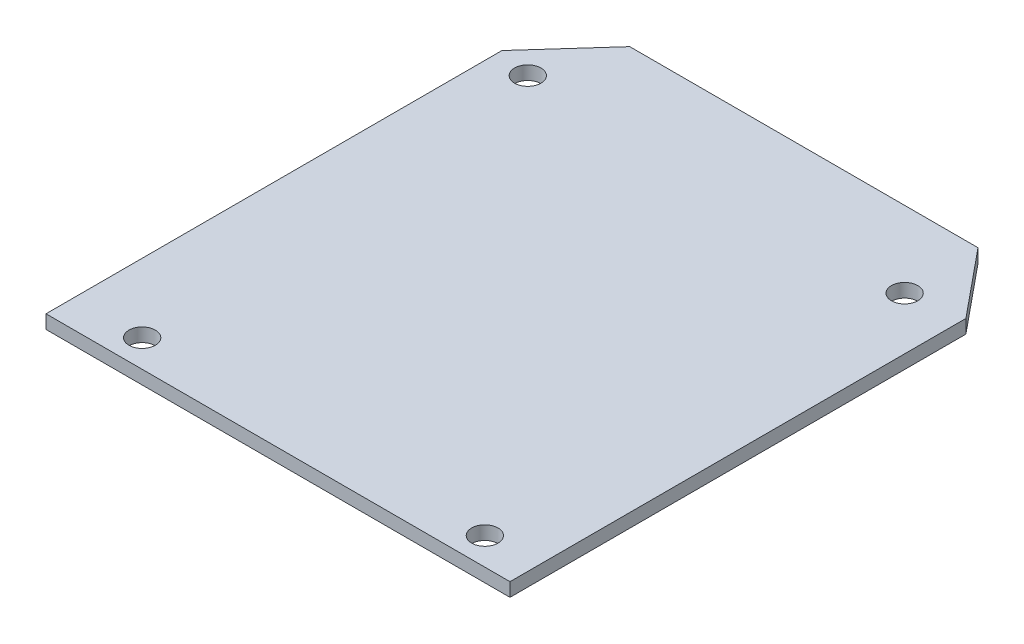
ISO-10303-21;
HEADER;
FILE_DESCRIPTION(('STEP AP214'),'2;1');
FILE_NAME('part.step','',(''),(''),'','','');
FILE_SCHEMA(('AUTOMOTIVE_DESIGN { 1 0 10303 214 1 1 1 1 }'));
ENDSEC;
DATA;
#1=APPLICATION_CONTEXT('core data for automotive mechanical design processes');
#2=APPLICATION_PROTOCOL_DEFINITION('international standard','automotive_design',2000,#1);
#3=PRODUCT_CONTEXT('',#1,'mechanical');
#4=PRODUCT('Part','Part','',(#3));
#5=PRODUCT_RELATED_PRODUCT_CATEGORY('part','',(#4));
#6=PRODUCT_DEFINITION_FORMATION('','',#4);
#7=PRODUCT_DEFINITION_CONTEXT('part definition',#1,'design');
#8=PRODUCT_DEFINITION('design','',#6,#7);
#9=PRODUCT_DEFINITION_SHAPE('','',#8);
#10=(LENGTH_UNIT() NAMED_UNIT(*) SI_UNIT(.MILLI.,.METRE.));
#11=(NAMED_UNIT(*) PLANE_ANGLE_UNIT() SI_UNIT($,.RADIAN.));
#12=(NAMED_UNIT(*) SI_UNIT($,.STERADIAN.) SOLID_ANGLE_UNIT());
#13=UNCERTAINTY_MEASURE_WITH_UNIT(LENGTH_MEASURE(1.E-05),#10,'distance_accuracy_value','');
#14=(GEOMETRIC_REPRESENTATION_CONTEXT(3) GLOBAL_UNCERTAINTY_ASSIGNED_CONTEXT((#13)) GLOBAL_UNIT_ASSIGNED_CONTEXT((#10,
#11,#12)) REPRESENTATION_CONTEXT('',''));
#15=CARTESIAN_POINT('',(0.,0.,0.));
#16=DIRECTION('',(0.,0.,1.));
#17=DIRECTION('',(1.,0.,0.));
#18=AXIS2_PLACEMENT_3D('',#15,#16,#17);
#19=CARTESIAN_POINT('',(-25.4,1.5875,31.75));
#20=DIRECTION('',(0.,0.,-1.));
#21=DIRECTION('',(-1.,0.,0.));
#22=AXIS2_PLACEMENT_3D('',#19,#20,#21);
#23=PLANE('',#22);
#24=DIRECTION('',(1.,0.,0.));
#25=VECTOR('',#24,1.);
#26=CARTESIAN_POINT('',(-25.4,1.5875,31.75));
#27=LINE('',#26,#25);
#28=CARTESIAN_POINT('',(-28.1388831989375,1.5875,31.75));
#29=VERTEX_POINT('',#28);
#30=CARTESIAN_POINT('',(28.1736861282768,1.5875,31.75));
#31=VERTEX_POINT('',#30);
#32=EDGE_CURVE('E50',#29,#31,#27,.T.);
#33=ORIENTED_EDGE('',*,*,#32,.F.);
#34=DIRECTION('',(0.,1.,0.));
#35=VECTOR('',#34,1.);
#36=CARTESIAN_POINT('',(-28.1388831989375,-0.0635,31.75));
#37=LINE('',#36,#35);
#38=CARTESIAN_POINT('',(-28.1388831989375,-0.0635,31.75));
#39=VERTEX_POINT('',#38);
#40=EDGE_CURVE('E119',#39,#29,#37,.T.);
#41=ORIENTED_EDGE('',*,*,#40,.F.);
#42=DIRECTION('',(1.,0.,0.));
#43=VECTOR('',#42,1.);
#44=CARTESIAN_POINT('',(-28.1388831989375,-0.0635,31.75));
#45=LINE('',#44,#43);
#46=CARTESIAN_POINT('',(28.1736861282768,-0.0635,31.75));
#47=VERTEX_POINT('',#46);
#48=EDGE_CURVE('E125',#39,#47,#45,.T.);
#49=ORIENTED_EDGE('',*,*,#48,.T.);
#50=DIRECTION('',(0.,1.,0.));
#51=VECTOR('',#50,1.);
#52=CARTESIAN_POINT('',(28.1736861282768,-0.0635,31.75));
#53=LINE('',#52,#51);
#54=EDGE_CURVE('E110',#47,#31,#53,.T.);
#55=ORIENTED_EDGE('',*,*,#54,.T.);
#56=EDGE_LOOP('',(#33,#41,#49,#55));
#57=FACE_BOUND('',#56,.T.);
#58=ADVANCED_FACE('F41',(#57),#23,.F.);
#59=CARTESIAN_POINT('',(-25.4,1.5875,-31.75));
#60=DIRECTION('',(0.,0.,1.));
#61=DIRECTION('',(1.,0.,0.));
#62=AXIS2_PLACEMENT_3D('',#59,#60,#61);
#63=PLANE('',#62);
#64=DIRECTION('',(-1.,0.,0.));
#65=VECTOR('',#64,1.);
#66=CARTESIAN_POINT('',(-25.4,1.5875,-31.75));
#67=LINE('',#66,#65);
#68=CARTESIAN_POINT('',(21.4730902903476,1.5875,-31.75));
#69=VERTEX_POINT('',#68);
#70=CARTESIAN_POINT('',(-20.7934211046502,1.5875,-31.75));
#71=VERTEX_POINT('',#70);
#72=EDGE_CURVE('E11',#69,#71,#67,.T.);
#73=ORIENTED_EDGE('',*,*,#72,.F.);
#74=DIRECTION('',(0.,1.,0.));
#75=VECTOR('',#74,1.);
#76=CARTESIAN_POINT('',(21.4730902903476,-0.0635,-31.75));
#77=LINE('',#76,#75);
#78=CARTESIAN_POINT('',(21.4730902903476,-0.0635,-31.75));
#79=VERTEX_POINT('',#78);
#80=EDGE_CURVE('E61',#79,#69,#77,.T.);
#81=ORIENTED_EDGE('',*,*,#80,.F.);
#82=DIRECTION('',(-1.,0.,0.));
#83=VECTOR('',#82,1.);
#84=CARTESIAN_POINT('',(-20.7934211046502,-0.0635,-31.75));
#85=LINE('',#84,#83);
#86=CARTESIAN_POINT('',(-20.7934211046502,-0.0635,-31.75));
#87=VERTEX_POINT('',#86);
#88=EDGE_CURVE('E155',#79,#87,#85,.T.);
#89=ORIENTED_EDGE('',*,*,#88,.T.);
#90=DIRECTION('',(0.,1.,0.));
#91=VECTOR('',#90,1.);
#92=CARTESIAN_POINT('',(-20.7934211046502,-0.0635,-31.75));
#93=LINE('',#92,#91);
#94=EDGE_CURVE('E99',#87,#71,#93,.T.);
#95=ORIENTED_EDGE('',*,*,#94,.T.);
#96=EDGE_LOOP('',(#73,#81,#89,#95));
#97=FACE_BOUND('',#96,.T.);
#98=ADVANCED_FACE('F197',(#97),#63,.F.);
#99=CARTESIAN_POINT('',(0.,1.5875,0.));
#100=DIRECTION('',(0.,1.,0.));
#101=DIRECTION('',(0.,0.,1.));
#102=AXIS2_PLACEMENT_3D('',#99,#100,#101);
#103=PLANE('',#102);
#104=CARTESIAN_POINT('',(21.8000857920604,1.5875,-22.5187904150701));
#105=DIRECTION('',(0.,1.,0.));
#106=DIRECTION('',(0.,0.,1.));
#107=AXIS2_PLACEMENT_3D('',#104,#105,#106);
#108=CIRCLE('',#107,1.6002);
#109=CARTESIAN_POINT('',(21.8000857920604,1.5875,-20.9185904150701));
#110=VERTEX_POINT('',#109);
#111=EDGE_CURVE('E187',#110,#110,#108,.T.);
#112=ORIENTED_EDGE('',*,*,#111,.F.);
#113=EDGE_LOOP('',(#112));
#114=FACE_BOUND('',#113,.T.);
#115=CARTESIAN_POINT('',(-23.9380994204934,1.5875,-22.5187904150701));
#116=DIRECTION('',(0.,1.,0.));
#117=DIRECTION('',(0.,0.,1.));
#118=AXIS2_PLACEMENT_3D('',#115,#116,#117);
#119=CIRCLE('',#118,1.6002);
#120=CARTESIAN_POINT('',(-23.9380994204934,1.5875,-20.9185904150701));
#121=VERTEX_POINT('',#120);
#122=EDGE_CURVE('E176',#121,#121,#119,.T.);
#123=ORIENTED_EDGE('',*,*,#122,.F.);
#124=EDGE_LOOP('',(#123));
#125=FACE_BOUND('',#124,.T.);
#126=CARTESIAN_POINT('',(-19.7900233457498,1.5875,28.4281023917217));
#127=DIRECTION('',(0.,1.,0.));
#128=DIRECTION('',(0.,0.,1.));
#129=AXIS2_PLACEMENT_3D('',#126,#127,#128);
#130=CIRCLE('',#129,1.6002);
#131=CARTESIAN_POINT('',(-19.7900233457498,1.5875,30.0283023917217));
#132=VERTEX_POINT('',#131);
#133=EDGE_CURVE('E172',#132,#132,#130,.T.);
#134=ORIENTED_EDGE('',*,*,#133,.F.);
#135=EDGE_LOOP('',(#134));
#136=FACE_BOUND('',#135,.T.);
#137=CARTESIAN_POINT('',(21.8000857920604,1.5875,28.4281023917217));
#138=DIRECTION('',(0.,1.,0.));
#139=DIRECTION('',(0.,0.,1.));
#140=AXIS2_PLACEMENT_3D('',#137,#138,#139);
#141=CIRCLE('',#140,1.6002);
#142=CARTESIAN_POINT('',(21.8000857920604,1.5875,30.0283023917217));
#143=VERTEX_POINT('',#142);
#144=EDGE_CURVE('E169',#143,#143,#141,.T.);
#145=ORIENTED_EDGE('',*,*,#144,.F.);
#146=EDGE_LOOP('',(#145));
#147=FACE_BOUND('',#146,.T.);
#148=DIRECTION('',(-0.634217019953723,0.,-0.773155076036509));
#149=VECTOR('',#148,1.);
#150=CARTESIAN_POINT('',(28.1736861282768,1.5875,-23.5815032211811));
#151=LINE('',#150,#149);
#152=CARTESIAN_POINT('',(28.1736861282768,1.5875,-23.5815032211811));
#153=VERTEX_POINT('',#152);
#154=EDGE_CURVE('E152',#153,#69,#151,.T.);
#155=ORIENTED_EDGE('',*,*,#154,.T.);
#156=ORIENTED_EDGE('',*,*,#72,.T.);
#157=DIRECTION('',(-0.668653613400306,0.,0.743574034838975));
#158=VECTOR('',#157,1.);
#159=CARTESIAN_POINT('',(-20.7934211046502,1.5875,-31.75));
#160=LINE('',#159,#158);
#161=CARTESIAN_POINT('',(-28.1388831989376,1.5875,-23.5815032211811));
#162=VERTEX_POINT('',#161);
#163=EDGE_CURVE('E142',#71,#162,#160,.T.);
#164=ORIENTED_EDGE('',*,*,#163,.T.);
#165=DIRECTION('',(0.,0.,1.));
#166=VECTOR('',#165,1.);
#167=CARTESIAN_POINT('',(-28.1388831989376,1.5875,-23.5815032211811));
#168=LINE('',#167,#166);
#169=EDGE_CURVE('E145',#162,#29,#168,.T.);
#170=ORIENTED_EDGE('',*,*,#169,.T.);
#171=ORIENTED_EDGE('',*,*,#32,.T.);
#172=DIRECTION('',(0.,0.,-1.));
#173=VECTOR('',#172,1.);
#174=CARTESIAN_POINT('',(28.1736861282768,1.5875,31.75));
#175=LINE('',#174,#173);
#176=EDGE_CURVE('E115',#31,#153,#175,.T.);
#177=ORIENTED_EDGE('',*,*,#176,.T.);
#178=EDGE_LOOP('',(#155,#156,#164,#170,#171,#177));
#179=FACE_BOUND('',#178,.T.);
#180=ADVANCED_FACE('F199',(#114,#125,#136,#147,#179),#103,.T.);
#181=CARTESIAN_POINT('',(28.1736861282768,-0.0635,-23.5815032211811));
#182=DIRECTION('',(0.773155076036508,0.,-0.634217019953723));
#183=DIRECTION('',(-0.634217019953723,0.,-0.773155076036509));
#184=AXIS2_PLACEMENT_3D('',#181,#182,#183);
#185=PLANE('',#184);
#186=ORIENTED_EDGE('',*,*,#80,.T.);
#187=ORIENTED_EDGE('',*,*,#154,.F.);
#188=DIRECTION('',(0.,1.,0.));
#189=VECTOR('',#188,1.);
#190=CARTESIAN_POINT('',(28.1736861282768,-0.0635,-23.5815032211811));
#191=LINE('',#190,#189);
#192=CARTESIAN_POINT('',(28.1736861282768,-0.0635,-23.5815032211811));
#193=VERTEX_POINT('',#192);
#194=EDGE_CURVE('E90',#193,#153,#191,.T.);
#195=ORIENTED_EDGE('',*,*,#194,.F.);
#196=DIRECTION('',(-0.634217019953723,0.,-0.773155076036509));
#197=VECTOR('',#196,1.);
#198=CARTESIAN_POINT('',(28.1736861282768,-0.0635,-23.5815032211811));
#199=LINE('',#198,#197);
#200=EDGE_CURVE('E127',#193,#79,#199,.T.);
#201=ORIENTED_EDGE('',*,*,#200,.T.);
#202=EDGE_LOOP('',(#186,#187,#195,#201));
#203=FACE_BOUND('',#202,.T.);
#204=ADVANCED_FACE('F200',(#203),#185,.T.);
#205=CARTESIAN_POINT('',(-20.7934211046502,-0.0635,-31.75));
#206=DIRECTION('',(-0.743574034838975,0.,-0.668653613400306));
#207=DIRECTION('',(-0.668653613400306,0.,0.743574034838975));
#208=AXIS2_PLACEMENT_3D('',#205,#206,#207);
#209=PLANE('',#208);
#210=ORIENTED_EDGE('',*,*,#163,.F.);
#211=ORIENTED_EDGE('',*,*,#94,.F.);
#212=DIRECTION('',(-0.668653613400306,0.,0.743574034838975));
#213=VECTOR('',#212,1.);
#214=CARTESIAN_POINT('',(-20.7934211046502,-0.0635,-31.75));
#215=LINE('',#214,#213);
#216=CARTESIAN_POINT('',(-28.1388831989376,-0.0635,-23.5815032211811));
#217=VERTEX_POINT('',#216);
#218=EDGE_CURVE('E136',#87,#217,#215,.T.);
#219=ORIENTED_EDGE('',*,*,#218,.T.);
#220=DIRECTION('',(0.,1.,0.));
#221=VECTOR('',#220,1.);
#222=CARTESIAN_POINT('',(-28.1388831989376,-0.0635,-23.5815032211811));
#223=LINE('',#222,#221);
#224=EDGE_CURVE('E160',#217,#162,#223,.T.);
#225=ORIENTED_EDGE('',*,*,#224,.T.);
#226=EDGE_LOOP('',(#210,#211,#219,#225));
#227=FACE_BOUND('',#226,.T.);
#228=ADVANCED_FACE('F195',(#227),#209,.T.);
#229=CARTESIAN_POINT('',(28.1736861282768,-0.0635,31.75));
#230=DIRECTION('',(1.,0.,0.));
#231=DIRECTION('',(0.,0.,-1.));
#232=AXIS2_PLACEMENT_3D('',#229,#230,#231);
#233=PLANE('',#232);
#234=ORIENTED_EDGE('',*,*,#176,.F.);
#235=ORIENTED_EDGE('',*,*,#54,.F.);
#236=DIRECTION('',(0.,0.,-1.));
#237=VECTOR('',#236,1.);
#238=CARTESIAN_POINT('',(28.1736861282768,-0.0635,31.75));
#239=LINE('',#238,#237);
#240=EDGE_CURVE('E113',#47,#193,#239,.T.);
#241=ORIENTED_EDGE('',*,*,#240,.T.);
#242=ORIENTED_EDGE('',*,*,#194,.T.);
#243=EDGE_LOOP('',(#234,#235,#241,#242));
#244=FACE_BOUND('',#243,.T.);
#245=ADVANCED_FACE('F112',(#244),#233,.T.);
#246=CARTESIAN_POINT('',(-28.1388831989376,-0.0635,-23.5815032211811));
#247=DIRECTION('',(-1.,0.,0.));
#248=DIRECTION('',(0.,0.,1.));
#249=AXIS2_PLACEMENT_3D('',#246,#247,#248);
#250=PLANE('',#249);
#251=ORIENTED_EDGE('',*,*,#169,.F.);
#252=ORIENTED_EDGE('',*,*,#224,.F.);
#253=DIRECTION('',(0.,0.,1.));
#254=VECTOR('',#253,1.);
#255=CARTESIAN_POINT('',(-28.1388831989376,-0.0635,-23.5815032211811));
#256=LINE('',#255,#254);
#257=EDGE_CURVE('E132',#217,#39,#256,.T.);
#258=ORIENTED_EDGE('',*,*,#257,.T.);
#259=ORIENTED_EDGE('',*,*,#40,.T.);
#260=EDGE_LOOP('',(#251,#252,#258,#259));
#261=FACE_BOUND('',#260,.T.);
#262=ADVANCED_FACE('F219',(#261),#250,.T.);
#263=CARTESIAN_POINT('',(0.,-0.0635,0.));
#264=DIRECTION('',(0.,1.,0.));
#265=DIRECTION('',(0.,0.,1.));
#266=AXIS2_PLACEMENT_3D('',#263,#264,#265);
#267=PLANE('',#266);
#268=CARTESIAN_POINT('',(21.8000857920604,-0.0635,-22.5187904150701));
#269=DIRECTION('',(0.,1.,0.));
#270=DIRECTION('',(0.,0.,1.));
#271=AXIS2_PLACEMENT_3D('',#268,#269,#270);
#272=CIRCLE('',#271,1.6002);
#273=CARTESIAN_POINT('',(21.8000857920604,-0.0635,-20.9185904150701));
#274=VERTEX_POINT('',#273);
#275=EDGE_CURVE('E44',#274,#274,#272,.T.);
#276=ORIENTED_EDGE('',*,*,#275,.T.);
#277=EDGE_LOOP('',(#276));
#278=FACE_BOUND('',#277,.T.);
#279=CARTESIAN_POINT('',(-23.9380994204934,-0.0635,-22.5187904150701));
#280=DIRECTION('',(0.,1.,0.));
#281=DIRECTION('',(0.,0.,1.));
#282=AXIS2_PLACEMENT_3D('',#279,#280,#281);
#283=CIRCLE('',#282,1.6002);
#284=CARTESIAN_POINT('',(-23.9380994204934,-0.0635,-20.9185904150701));
#285=VERTEX_POINT('',#284);
#286=EDGE_CURVE('E173',#285,#285,#283,.T.);
#287=ORIENTED_EDGE('',*,*,#286,.T.);
#288=EDGE_LOOP('',(#287));
#289=FACE_BOUND('',#288,.T.);
#290=CARTESIAN_POINT('',(-19.7900233457498,-0.0635,28.4281023917217));
#291=DIRECTION('',(0.,1.,0.));
#292=DIRECTION('',(0.,0.,1.));
#293=AXIS2_PLACEMENT_3D('',#290,#291,#292);
#294=CIRCLE('',#293,1.6002);
#295=CARTESIAN_POINT('',(-19.7900233457498,-0.0635,30.0283023917217));
#296=VERTEX_POINT('',#295);
#297=EDGE_CURVE('E170',#296,#296,#294,.T.);
#298=ORIENTED_EDGE('',*,*,#297,.T.);
#299=EDGE_LOOP('',(#298));
#300=FACE_BOUND('',#299,.T.);
#301=CARTESIAN_POINT('',(21.8000857920604,-0.0635,28.4281023917217));
#302=DIRECTION('',(0.,1.,0.));
#303=DIRECTION('',(0.,0.,1.));
#304=AXIS2_PLACEMENT_3D('',#301,#302,#303);
#305=CIRCLE('',#304,1.6002);
#306=CARTESIAN_POINT('',(21.8000857920604,-0.0635,30.0283023917217));
#307=VERTEX_POINT('',#306);
#308=EDGE_CURVE('E146',#307,#307,#305,.T.);
#309=ORIENTED_EDGE('',*,*,#308,.T.);
#310=EDGE_LOOP('',(#309));
#311=FACE_BOUND('',#310,.T.);
#312=ORIENTED_EDGE('',*,*,#88,.F.);
#313=ORIENTED_EDGE('',*,*,#200,.F.);
#314=ORIENTED_EDGE('',*,*,#240,.F.);
#315=ORIENTED_EDGE('',*,*,#48,.F.);
#316=ORIENTED_EDGE('',*,*,#257,.F.);
#317=ORIENTED_EDGE('',*,*,#218,.F.);
#318=EDGE_LOOP('',(#312,#313,#314,#315,#316,#317));
#319=FACE_BOUND('',#318,.T.);
#320=ADVANCED_FACE('F123',(#278,#289,#300,#311,#319),#267,.F.);
#321=CARTESIAN_POINT('',(21.8000857920604,-0.1905,28.4281023917217));
#322=DIRECTION('',(0.,1.,0.));
#323=DIRECTION('',(0.,0.,1.));
#324=AXIS2_PLACEMENT_3D('',#321,#322,#323);
#325=CYLINDRICAL_SURFACE('',#324,1.6002);
#326=ORIENTED_EDGE('',*,*,#144,.T.);
#327=EDGE_LOOP('',(#326));
#328=FACE_BOUND('',#327,.T.);
#329=ORIENTED_EDGE('',*,*,#308,.F.);
#330=EDGE_LOOP('',(#329));
#331=FACE_BOUND('',#330,.T.);
#332=ADVANCED_FACE('F236',(#328,#331),#325,.F.);
#333=CARTESIAN_POINT('',(-19.7900233457498,-0.1905,28.4281023917217));
#334=DIRECTION('',(0.,1.,0.));
#335=DIRECTION('',(0.,0.,1.));
#336=AXIS2_PLACEMENT_3D('',#333,#334,#335);
#337=CYLINDRICAL_SURFACE('',#336,1.6002);
#338=ORIENTED_EDGE('',*,*,#133,.T.);
#339=EDGE_LOOP('',(#338));
#340=FACE_BOUND('',#339,.T.);
#341=ORIENTED_EDGE('',*,*,#297,.F.);
#342=EDGE_LOOP('',(#341));
#343=FACE_BOUND('',#342,.T.);
#344=ADVANCED_FACE('F243',(#340,#343),#337,.F.);
#345=CARTESIAN_POINT('',(-23.9380994204934,-0.1905,-22.5187904150701));
#346=DIRECTION('',(0.,1.,0.));
#347=DIRECTION('',(0.,0.,1.));
#348=AXIS2_PLACEMENT_3D('',#345,#346,#347);
#349=CYLINDRICAL_SURFACE('',#348,1.6002);
#350=ORIENTED_EDGE('',*,*,#122,.T.);
#351=EDGE_LOOP('',(#350));
#352=FACE_BOUND('',#351,.T.);
#353=ORIENTED_EDGE('',*,*,#286,.F.);
#354=EDGE_LOOP('',(#353));
#355=FACE_BOUND('',#354,.T.);
#356=ADVANCED_FACE('F251',(#352,#355),#349,.F.);
#357=CARTESIAN_POINT('',(21.8000857920604,-0.1905,-22.5187904150701));
#358=DIRECTION('',(0.,1.,0.));
#359=DIRECTION('',(0.,0.,1.));
#360=AXIS2_PLACEMENT_3D('',#357,#358,#359);
#361=CYLINDRICAL_SURFACE('',#360,1.6002);
#362=ORIENTED_EDGE('',*,*,#111,.T.);
#363=EDGE_LOOP('',(#362));
#364=FACE_BOUND('',#363,.T.);
#365=ORIENTED_EDGE('',*,*,#275,.F.);
#366=EDGE_LOOP('',(#365));
#367=FACE_BOUND('',#366,.T.);
#368=ADVANCED_FACE('F259',(#364,#367),#361,.F.);
#369=CLOSED_SHELL('',(#58,#98,#180,#204,#228,#245,#262,#320,#332,#344,#356,#368));
#370=MANIFOLD_SOLID_BREP('B2',#369);
#371=ADVANCED_BREP_SHAPE_REPRESENTATION('',(#18,#370),#14);
#372=SHAPE_DEFINITION_REPRESENTATION(#9,#371);
ENDSEC;
END-ISO-10303-21;
